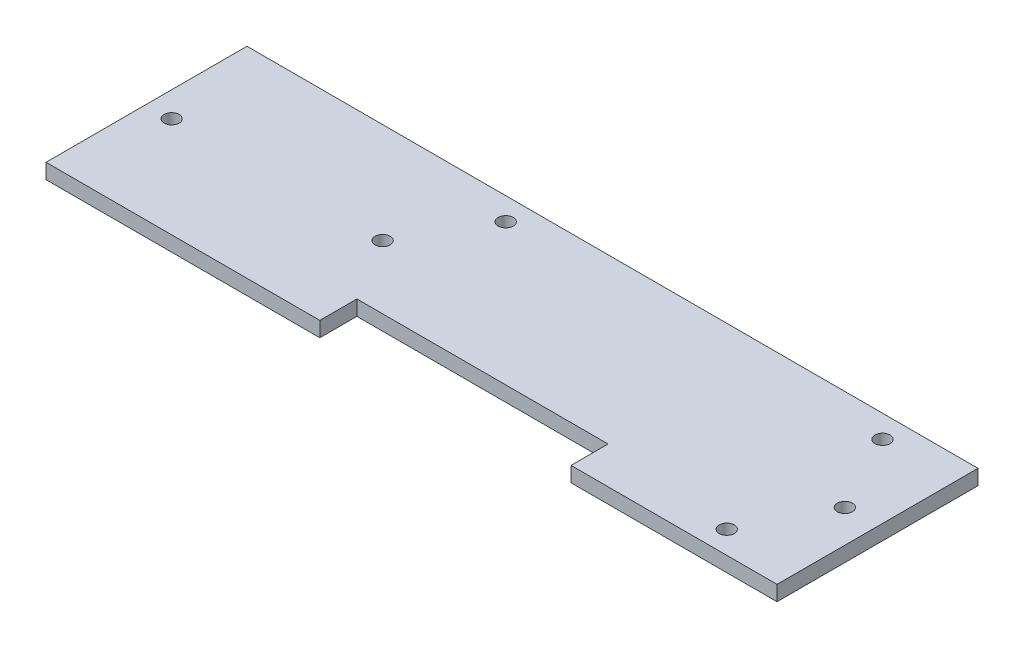
ISO-10303-21;
HEADER;
FILE_DESCRIPTION(('STEP AP214'),'2;1');
FILE_NAME('part.step','',(''),(''),'','','');
FILE_SCHEMA(('AUTOMOTIVE_DESIGN { 1 0 10303 214 1 1 1 1 }'));
ENDSEC;
DATA;
#1=APPLICATION_CONTEXT('core data for automotive mechanical design processes');
#2=APPLICATION_PROTOCOL_DEFINITION('international standard','automotive_design',2000,#1);
#3=PRODUCT_CONTEXT('',#1,'mechanical');
#4=PRODUCT('Part','Part','',(#3));
#5=PRODUCT_RELATED_PRODUCT_CATEGORY('part','',(#4));
#6=PRODUCT_DEFINITION_FORMATION('','',#4);
#7=PRODUCT_DEFINITION_CONTEXT('part definition',#1,'design');
#8=PRODUCT_DEFINITION('design','',#6,#7);
#9=PRODUCT_DEFINITION_SHAPE('','',#8);
#10=(LENGTH_UNIT() NAMED_UNIT(*) SI_UNIT(.MILLI.,.METRE.));
#11=(NAMED_UNIT(*) PLANE_ANGLE_UNIT() SI_UNIT($,.RADIAN.));
#12=(NAMED_UNIT(*) SI_UNIT($,.STERADIAN.) SOLID_ANGLE_UNIT());
#13=UNCERTAINTY_MEASURE_WITH_UNIT(LENGTH_MEASURE(1.E-05),#10,'distance_accuracy_value','');
#14=(GEOMETRIC_REPRESENTATION_CONTEXT(3) GLOBAL_UNCERTAINTY_ASSIGNED_CONTEXT((#13)) GLOBAL_UNIT_ASSIGNED_CONTEXT((#10,
#11,#12)) REPRESENTATION_CONTEXT('',''));
#15=CARTESIAN_POINT('',(0.,0.,0.));
#16=DIRECTION('',(0.,0.,1.));
#17=DIRECTION('',(1.,0.,0.));
#18=AXIS2_PLACEMENT_3D('',#15,#16,#17);
#19=CARTESIAN_POINT('',(104.5,3.,0.));
#20=DIRECTION('',(-1.,0.,0.));
#21=DIRECTION('',(0.,0.,1.));
#22=AXIS2_PLACEMENT_3D('',#19,#20,#21);
#23=PLANE('',#22);
#24=DIRECTION('',(0.,0.,-1.));
#25=VECTOR('',#24,1.);
#26=CARTESIAN_POINT('',(104.5,0.,0.));
#27=LINE('',#26,#25);
#28=CARTESIAN_POINT('',(104.5,0.,40.));
#29=VERTEX_POINT('',#28);
#30=CARTESIAN_POINT('',(104.5,0.,32.6201975596373));
#31=VERTEX_POINT('',#30);
#32=EDGE_CURVE('E166',#29,#31,#27,.T.);
#33=ORIENTED_EDGE('',*,*,#32,.F.);
#34=DIRECTION('',(0.,-1.,0.));
#35=VECTOR('',#34,1.);
#36=CARTESIAN_POINT('',(104.5,3.,40.));
#37=LINE('',#36,#35);
#38=CARTESIAN_POINT('',(104.5,3.,40.));
#39=VERTEX_POINT('',#38);
#40=EDGE_CURVE('E11',#39,#29,#37,.T.);
#41=ORIENTED_EDGE('',*,*,#40,.F.);
#42=DIRECTION('',(0.,0.,-1.));
#43=VECTOR('',#42,1.);
#44=CARTESIAN_POINT('',(104.5,3.,0.));
#45=LINE('',#44,#43);
#46=CARTESIAN_POINT('',(104.5,3.,32.6201975596373));
#47=VERTEX_POINT('',#46);
#48=EDGE_CURVE('E297',#39,#47,#45,.T.);
#49=ORIENTED_EDGE('',*,*,#48,.T.);
#50=DIRECTION('',(0.,-1.,0.));
#51=VECTOR('',#50,1.);
#52=CARTESIAN_POINT('',(104.5,3.,32.6201975596373));
#53=LINE('',#52,#51);
#54=EDGE_CURVE('E91',#47,#31,#53,.T.);
#55=ORIENTED_EDGE('',*,*,#54,.T.);
#56=EDGE_LOOP('',(#33,#41,#49,#55));
#57=FACE_BOUND('',#56,.T.);
#58=ADVANCED_FACE('F39',(#57),#23,.T.);
#59=CARTESIAN_POINT('',(0.,3.,40.));
#60=DIRECTION('',(0.,0.,-1.));
#61=DIRECTION('',(-1.,0.,0.));
#62=AXIS2_PLACEMENT_3D('',#59,#60,#61);
#63=PLANE('',#62);
#64=DIRECTION('',(1.,0.,0.));
#65=VECTOR('',#64,1.);
#66=CARTESIAN_POINT('',(0.,0.,40.));
#67=LINE('',#66,#65);
#68=CARTESIAN_POINT('',(145.508062676638,0.,40.));
#69=VERTEX_POINT('',#68);
#70=EDGE_CURVE('E163',#29,#69,#67,.T.);
#71=ORIENTED_EDGE('',*,*,#70,.T.);
#72=DIRECTION('',(0.,-1.,0.));
#73=VECTOR('',#72,1.);
#74=CARTESIAN_POINT('',(145.508062676638,3.,40.));
#75=LINE('',#74,#73);
#76=CARTESIAN_POINT('',(145.508062676638,3.,40.));
#77=VERTEX_POINT('',#76);
#78=EDGE_CURVE('E49',#77,#69,#75,.T.);
#79=ORIENTED_EDGE('',*,*,#78,.F.);
#80=DIRECTION('',(1.,0.,0.));
#81=VECTOR('',#80,1.);
#82=CARTESIAN_POINT('',(0.,3.,40.));
#83=LINE('',#82,#81);
#84=EDGE_CURVE('E132',#39,#77,#83,.T.);
#85=ORIENTED_EDGE('',*,*,#84,.F.);
#86=ORIENTED_EDGE('',*,*,#40,.T.);
#87=EDGE_LOOP('',(#71,#79,#85,#86));
#88=FACE_BOUND('',#87,.T.);
#89=ADVANCED_FACE('F164',(#88),#63,.F.);
#90=CARTESIAN_POINT('',(145.508062676638,3.,-1.00966500907628E-13));
#91=DIRECTION('',(1.,0.,0.));
#92=DIRECTION('',(0.,0.,-1.));
#93=AXIS2_PLACEMENT_3D('',#90,#91,#92);
#94=PLANE('',#93);
#95=DIRECTION('',(0.,0.,1.));
#96=VECTOR('',#95,1.);
#97=CARTESIAN_POINT('',(145.508062676638,0.,-1.00966500907628E-13));
#98=LINE('',#97,#96);
#99=CARTESIAN_POINT('',(145.508062676638,0.,0.));
#100=VERTEX_POINT('',#99);
#101=EDGE_CURVE('E157',#100,#69,#98,.T.);
#102=ORIENTED_EDGE('',*,*,#101,.F.);
#103=DIRECTION('',(0.,-1.,0.));
#104=VECTOR('',#103,1.);
#105=CARTESIAN_POINT('',(145.508062676638,3.,0.));
#106=LINE('',#105,#104);
#107=CARTESIAN_POINT('',(145.508062676638,3.,0.));
#108=VERTEX_POINT('',#107);
#109=EDGE_CURVE('E147',#108,#100,#106,.T.);
#110=ORIENTED_EDGE('',*,*,#109,.F.);
#111=DIRECTION('',(0.,0.,1.));
#112=VECTOR('',#111,1.);
#113=CARTESIAN_POINT('',(145.508062676638,3.,-1.00966500907628E-13));
#114=LINE('',#113,#112);
#115=EDGE_CURVE('E160',#108,#77,#114,.T.);
#116=ORIENTED_EDGE('',*,*,#115,.T.);
#117=ORIENTED_EDGE('',*,*,#78,.T.);
#118=EDGE_LOOP('',(#102,#110,#116,#117));
#119=FACE_BOUND('',#118,.T.);
#120=ADVANCED_FACE('F155',(#119),#94,.T.);
#121=CARTESIAN_POINT('',(0.,3.,0.));
#122=DIRECTION('',(0.,0.,-1.));
#123=DIRECTION('',(-1.,0.,0.));
#124=AXIS2_PLACEMENT_3D('',#121,#122,#123);
#125=PLANE('',#124);
#126=DIRECTION('',(1.,0.,0.));
#127=VECTOR('',#126,1.);
#128=CARTESIAN_POINT('',(0.,0.,0.));
#129=LINE('',#128,#127);
#130=CARTESIAN_POINT('',(0.,0.,0.));
#131=VERTEX_POINT('',#130);
#132=EDGE_CURVE('E171',#131,#100,#129,.T.);
#133=ORIENTED_EDGE('',*,*,#132,.F.);
#134=DIRECTION('',(0.,-1.,0.));
#135=VECTOR('',#134,1.);
#136=CARTESIAN_POINT('',(0.,3.,0.));
#137=LINE('',#136,#135);
#138=CARTESIAN_POINT('',(0.,3.,0.));
#139=VERTEX_POINT('',#138);
#140=EDGE_CURVE('E140',#139,#131,#137,.T.);
#141=ORIENTED_EDGE('',*,*,#140,.F.);
#142=DIRECTION('',(1.,0.,0.));
#143=VECTOR('',#142,1.);
#144=CARTESIAN_POINT('',(0.,3.,0.));
#145=LINE('',#144,#143);
#146=EDGE_CURVE('E291',#139,#108,#145,.T.);
#147=ORIENTED_EDGE('',*,*,#146,.T.);
#148=ORIENTED_EDGE('',*,*,#109,.T.);
#149=EDGE_LOOP('',(#133,#141,#147,#148));
#150=FACE_BOUND('',#149,.T.);
#151=ADVANCED_FACE('F283',(#150),#125,.T.);
#152=CARTESIAN_POINT('',(0.,3.,0.));
#153=DIRECTION('',(1.,0.,0.));
#154=DIRECTION('',(0.,0.,-1.));
#155=AXIS2_PLACEMENT_3D('',#152,#153,#154);
#156=PLANE('',#155);
#157=DIRECTION('',(0.,0.,1.));
#158=VECTOR('',#157,1.);
#159=CARTESIAN_POINT('',(0.,0.,0.));
#160=LINE('',#159,#158);
#161=CARTESIAN_POINT('',(0.,0.,40.));
#162=VERTEX_POINT('',#161);
#163=EDGE_CURVE('E175',#131,#162,#160,.T.);
#164=ORIENTED_EDGE('',*,*,#163,.T.);
#165=DIRECTION('',(0.,-1.,0.));
#166=VECTOR('',#165,1.);
#167=CARTESIAN_POINT('',(0.,3.,40.));
#168=LINE('',#167,#166);
#169=CARTESIAN_POINT('',(0.,3.,40.));
#170=VERTEX_POINT('',#169);
#171=EDGE_CURVE('E136',#170,#162,#168,.T.);
#172=ORIENTED_EDGE('',*,*,#171,.F.);
#173=DIRECTION('',(0.,0.,1.));
#174=VECTOR('',#173,1.);
#175=CARTESIAN_POINT('',(0.,3.,0.));
#176=LINE('',#175,#174);
#177=EDGE_CURVE('E126',#139,#170,#176,.T.);
#178=ORIENTED_EDGE('',*,*,#177,.F.);
#179=ORIENTED_EDGE('',*,*,#140,.T.);
#180=EDGE_LOOP('',(#164,#172,#178,#179));
#181=FACE_BOUND('',#180,.T.);
#182=ADVANCED_FACE('F281',(#181),#156,.F.);
#183=CARTESIAN_POINT('',(54.5,0.,40.));
#184=VERTEX_POINT('',#183);
#185=EDGE_CURVE('E134',#162,#184,#67,.T.);
#186=ORIENTED_EDGE('',*,*,#185,.T.);
#187=DIRECTION('',(0.,-1.,0.));
#188=VECTOR('',#187,1.);
#189=CARTESIAN_POINT('',(54.5,3.,40.));
#190=LINE('',#189,#188);
#191=CARTESIAN_POINT('',(54.5,3.,40.));
#192=VERTEX_POINT('',#191);
#193=EDGE_CURVE('E116',#192,#184,#190,.T.);
#194=ORIENTED_EDGE('',*,*,#193,.F.);
#195=EDGE_CURVE('E120',#170,#192,#83,.T.);
#196=ORIENTED_EDGE('',*,*,#195,.F.);
#197=ORIENTED_EDGE('',*,*,#171,.T.);
#198=EDGE_LOOP('',(#186,#194,#196,#197));
#199=FACE_BOUND('',#198,.T.);
#200=ADVANCED_FACE('F133',(#199),#63,.F.);
#201=CARTESIAN_POINT('',(54.5,3.,0.));
#202=DIRECTION('',(-1.,0.,0.));
#203=DIRECTION('',(0.,0.,1.));
#204=AXIS2_PLACEMENT_3D('',#201,#202,#203);
#205=PLANE('',#204);
#206=DIRECTION('',(0.,0.,-1.));
#207=VECTOR('',#206,1.);
#208=CARTESIAN_POINT('',(54.5,0.,0.));
#209=LINE('',#208,#207);
#210=CARTESIAN_POINT('',(54.5,0.,32.6201975596373));
#211=VERTEX_POINT('',#210);
#212=EDGE_CURVE('E182',#184,#211,#209,.T.);
#213=ORIENTED_EDGE('',*,*,#212,.T.);
#214=DIRECTION('',(0.,-1.,0.));
#215=VECTOR('',#214,1.);
#216=CARTESIAN_POINT('',(54.5,3.,32.6201975596373));
#217=LINE('',#216,#215);
#218=CARTESIAN_POINT('',(54.5,3.,32.6201975596373));
#219=VERTEX_POINT('',#218);
#220=EDGE_CURVE('E118',#219,#211,#217,.T.);
#221=ORIENTED_EDGE('',*,*,#220,.F.);
#222=DIRECTION('',(0.,0.,-1.));
#223=VECTOR('',#222,1.);
#224=CARTESIAN_POINT('',(54.5,3.,0.));
#225=LINE('',#224,#223);
#226=EDGE_CURVE('E111',#192,#219,#225,.T.);
#227=ORIENTED_EDGE('',*,*,#226,.F.);
#228=ORIENTED_EDGE('',*,*,#193,.T.);
#229=EDGE_LOOP('',(#213,#221,#227,#228));
#230=FACE_BOUND('',#229,.T.);
#231=ADVANCED_FACE('F114',(#230),#205,.F.);
#232=CARTESIAN_POINT('',(5.,3.,20.));
#233=DIRECTION('',(0.,-1.,0.));
#234=DIRECTION('',(0.,0.,-1.));
#235=AXIS2_PLACEMENT_3D('',#232,#233,#234);
#236=CYLINDRICAL_SURFACE('',#235,1.5);
#237=CARTESIAN_POINT('',(5.,3.,20.));
#238=DIRECTION('',(0.,1.,0.));
#239=DIRECTION('',(0.,0.,1.));
#240=AXIS2_PLACEMENT_3D('',#237,#238,#239);
#241=CIRCLE('',#240,1.5);
#242=CARTESIAN_POINT('',(5.,3.,21.5));
#243=VERTEX_POINT('',#242);
#244=EDGE_CURVE('E302',#243,#243,#241,.T.);
#245=ORIENTED_EDGE('',*,*,#244,.T.);
#246=EDGE_LOOP('',(#245));
#247=FACE_BOUND('',#246,.T.);
#248=CARTESIAN_POINT('',(5.,0.,20.));
#249=DIRECTION('',(0.,1.,0.));
#250=DIRECTION('',(0.,0.,1.));
#251=AXIS2_PLACEMENT_3D('',#248,#249,#250);
#252=CIRCLE('',#251,1.5);
#253=CARTESIAN_POINT('',(5.,0.,21.5));
#254=VERTEX_POINT('',#253);
#255=EDGE_CURVE('E212',#254,#254,#252,.T.);
#256=ORIENTED_EDGE('',*,*,#255,.F.);
#257=EDGE_LOOP('',(#256));
#258=FACE_BOUND('',#257,.T.);
#259=ADVANCED_FACE('F225',(#247,#258),#236,.F.);
#260=CARTESIAN_POINT('',(47.,3.,20.));
#261=DIRECTION('',(0.,-1.,0.));
#262=DIRECTION('',(0.,0.,-1.));
#263=AXIS2_PLACEMENT_3D('',#260,#261,#262);
#264=CYLINDRICAL_SURFACE('',#263,1.5);
#265=CARTESIAN_POINT('',(47.,3.,20.));
#266=DIRECTION('',(0.,1.,0.));
#267=DIRECTION('',(0.,0.,1.));
#268=AXIS2_PLACEMENT_3D('',#265,#266,#267);
#269=CIRCLE('',#268,1.5);
#270=CARTESIAN_POINT('',(47.,3.,21.5));
#271=VERTEX_POINT('',#270);
#272=EDGE_CURVE('E306',#271,#271,#269,.T.);
#273=ORIENTED_EDGE('',*,*,#272,.T.);
#274=EDGE_LOOP('',(#273));
#275=FACE_BOUND('',#274,.T.);
#276=CARTESIAN_POINT('',(47.,0.,20.));
#277=DIRECTION('',(0.,1.,0.));
#278=DIRECTION('',(0.,0.,1.));
#279=AXIS2_PLACEMENT_3D('',#276,#277,#278);
#280=CIRCLE('',#279,1.5);
#281=CARTESIAN_POINT('',(47.,0.,21.5));
#282=VERTEX_POINT('',#281);
#283=EDGE_CURVE('E208',#282,#282,#280,.T.);
#284=ORIENTED_EDGE('',*,*,#283,.F.);
#285=EDGE_LOOP('',(#284));
#286=FACE_BOUND('',#285,.T.);
#287=ADVANCED_FACE('F228',(#275,#286),#264,.F.);
#288=CARTESIAN_POINT('',(131.,3.,35.5));
#289=DIRECTION('',(0.,-1.,0.));
#290=DIRECTION('',(0.,0.,-1.));
#291=AXIS2_PLACEMENT_3D('',#288,#289,#290);
#292=CYLINDRICAL_SURFACE('',#291,1.5);
#293=CARTESIAN_POINT('',(131.,3.,35.5));
#294=DIRECTION('',(0.,1.,0.));
#295=DIRECTION('',(0.,0.,1.));
#296=AXIS2_PLACEMENT_3D('',#293,#294,#295);
#297=CIRCLE('',#296,1.5);
#298=CARTESIAN_POINT('',(131.,3.,37.));
#299=VERTEX_POINT('',#298);
#300=EDGE_CURVE('E310',#299,#299,#297,.T.);
#301=ORIENTED_EDGE('',*,*,#300,.T.);
#302=EDGE_LOOP('',(#301));
#303=FACE_BOUND('',#302,.T.);
#304=CARTESIAN_POINT('',(131.,0.,35.5));
#305=DIRECTION('',(0.,1.,0.));
#306=DIRECTION('',(0.,0.,1.));
#307=AXIS2_PLACEMENT_3D('',#304,#305,#306);
#308=CIRCLE('',#307,1.5);
#309=CARTESIAN_POINT('',(131.,0.,37.));
#310=VERTEX_POINT('',#309);
#311=EDGE_CURVE('E204',#310,#310,#308,.T.);
#312=ORIENTED_EDGE('',*,*,#311,.F.);
#313=EDGE_LOOP('',(#312));
#314=FACE_BOUND('',#313,.T.);
#315=ADVANCED_FACE('F232',(#303,#314),#292,.F.);
#316=CARTESIAN_POINT('',(131.,3.,4.50000000000002));
#317=DIRECTION('',(0.,-1.,0.));
#318=DIRECTION('',(0.,0.,-1.));
#319=AXIS2_PLACEMENT_3D('',#316,#317,#318);
#320=CYLINDRICAL_SURFACE('',#319,1.5);
#321=CARTESIAN_POINT('',(131.,3.,4.50000000000002));
#322=DIRECTION('',(0.,1.,0.));
#323=DIRECTION('',(0.,0.,1.));
#324=AXIS2_PLACEMENT_3D('',#321,#322,#323);
#325=CIRCLE('',#324,1.5);
#326=CARTESIAN_POINT('',(131.,3.,6.00000000000002));
#327=VERTEX_POINT('',#326);
#328=EDGE_CURVE('E314',#327,#327,#325,.T.);
#329=ORIENTED_EDGE('',*,*,#328,.T.);
#330=EDGE_LOOP('',(#329));
#331=FACE_BOUND('',#330,.T.);
#332=CARTESIAN_POINT('',(131.,0.,4.50000000000002));
#333=DIRECTION('',(0.,1.,0.));
#334=DIRECTION('',(0.,0.,1.));
#335=AXIS2_PLACEMENT_3D('',#332,#333,#334);
#336=CIRCLE('',#335,1.5);
#337=CARTESIAN_POINT('',(131.,0.,6.00000000000002));
#338=VERTEX_POINT('',#337);
#339=EDGE_CURVE('E200',#338,#338,#336,.T.);
#340=ORIENTED_EDGE('',*,*,#339,.F.);
#341=EDGE_LOOP('',(#340));
#342=FACE_BOUND('',#341,.T.);
#343=ADVANCED_FACE('F236',(#331,#342),#320,.F.);
#344=CARTESIAN_POINT('',(56.,3.,4.50000000000002));
#345=DIRECTION('',(0.,-1.,0.));
#346=DIRECTION('',(0.,0.,-1.));
#347=AXIS2_PLACEMENT_3D('',#344,#345,#346);
#348=CYLINDRICAL_SURFACE('',#347,1.5);
#349=CARTESIAN_POINT('',(56.,3.,4.50000000000002));
#350=DIRECTION('',(0.,1.,0.));
#351=DIRECTION('',(0.,0.,1.));
#352=AXIS2_PLACEMENT_3D('',#349,#350,#351);
#353=CIRCLE('',#352,1.5);
#354=CARTESIAN_POINT('',(56.,3.,6.00000000000002));
#355=VERTEX_POINT('',#354);
#356=EDGE_CURVE('E251',#355,#355,#353,.T.);
#357=ORIENTED_EDGE('',*,*,#356,.T.);
#358=EDGE_LOOP('',(#357));
#359=FACE_BOUND('',#358,.T.);
#360=CARTESIAN_POINT('',(56.,0.,4.50000000000002));
#361=DIRECTION('',(0.,1.,0.));
#362=DIRECTION('',(0.,0.,1.));
#363=AXIS2_PLACEMENT_3D('',#360,#361,#362);
#364=CIRCLE('',#363,1.5);
#365=CARTESIAN_POINT('',(56.,0.,6.00000000000002));
#366=VERTEX_POINT('',#365);
#367=EDGE_CURVE('E196',#366,#366,#364,.T.);
#368=ORIENTED_EDGE('',*,*,#367,.F.);
#369=EDGE_LOOP('',(#368));
#370=FACE_BOUND('',#369,.T.);
#371=ADVANCED_FACE('F239',(#359,#370),#348,.F.);
#372=CARTESIAN_POINT('',(139.,3.,20.));
#373=DIRECTION('',(0.,-1.,0.));
#374=DIRECTION('',(0.,0.,-1.));
#375=AXIS2_PLACEMENT_3D('',#372,#373,#374);
#376=CYLINDRICAL_SURFACE('',#375,1.5);
#377=CARTESIAN_POINT('',(139.,3.,20.));
#378=DIRECTION('',(0.,1.,0.));
#379=DIRECTION('',(0.,0.,1.));
#380=AXIS2_PLACEMENT_3D('',#377,#378,#379);
#381=CIRCLE('',#380,1.5);
#382=CARTESIAN_POINT('',(139.,3.,21.5));
#383=VERTEX_POINT('',#382);
#384=EDGE_CURVE('E186',#383,#383,#381,.T.);
#385=ORIENTED_EDGE('',*,*,#384,.T.);
#386=EDGE_LOOP('',(#385));
#387=FACE_BOUND('',#386,.T.);
#388=CARTESIAN_POINT('',(139.,0.,20.));
#389=DIRECTION('',(0.,1.,0.));
#390=DIRECTION('',(0.,0.,1.));
#391=AXIS2_PLACEMENT_3D('',#388,#389,#390);
#392=CIRCLE('',#391,1.5);
#393=CARTESIAN_POINT('',(139.,0.,21.5));
#394=VERTEX_POINT('',#393);
#395=EDGE_CURVE('E192',#394,#394,#392,.T.);
#396=ORIENTED_EDGE('',*,*,#395,.F.);
#397=EDGE_LOOP('',(#396));
#398=FACE_BOUND('',#397,.T.);
#399=ADVANCED_FACE('F41',(#387,#398),#376,.F.);
#400=CARTESIAN_POINT('',(0.,3.,32.6201975596373));
#401=DIRECTION('',(0.,0.,-1.));
#402=DIRECTION('',(-1.,0.,0.));
#403=AXIS2_PLACEMENT_3D('',#400,#401,#402);
#404=PLANE('',#403);
#405=DIRECTION('',(1.,0.,0.));
#406=VECTOR('',#405,1.);
#407=CARTESIAN_POINT('',(0.,0.,32.6201975596373));
#408=LINE('',#407,#406);
#409=EDGE_CURVE('E84',#211,#31,#408,.T.);
#410=ORIENTED_EDGE('',*,*,#409,.T.);
#411=ORIENTED_EDGE('',*,*,#54,.F.);
#412=DIRECTION('',(1.,0.,0.));
#413=VECTOR('',#412,1.);
#414=CARTESIAN_POINT('',(0.,3.,32.6201975596373));
#415=LINE('',#414,#413);
#416=EDGE_CURVE('E57',#219,#47,#415,.T.);
#417=ORIENTED_EDGE('',*,*,#416,.F.);
#418=ORIENTED_EDGE('',*,*,#220,.T.);
#419=EDGE_LOOP('',(#410,#411,#417,#418));
#420=FACE_BOUND('',#419,.T.);
#421=ADVANCED_FACE('F246',(#420),#404,.F.);
#422=CARTESIAN_POINT('',(0.,3.,0.));
#423=DIRECTION('',(0.,1.,0.));
#424=DIRECTION('',(0.,0.,1.));
#425=AXIS2_PLACEMENT_3D('',#422,#423,#424);
#426=PLANE('',#425);
#427=ORIENTED_EDGE('',*,*,#384,.F.);
#428=EDGE_LOOP('',(#427));
#429=FACE_BOUND('',#428,.T.);
#430=ORIENTED_EDGE('',*,*,#356,.F.);
#431=EDGE_LOOP('',(#430));
#432=FACE_BOUND('',#431,.T.);
#433=ORIENTED_EDGE('',*,*,#328,.F.);
#434=EDGE_LOOP('',(#433));
#435=FACE_BOUND('',#434,.T.);
#436=ORIENTED_EDGE('',*,*,#300,.F.);
#437=EDGE_LOOP('',(#436));
#438=FACE_BOUND('',#437,.T.);
#439=ORIENTED_EDGE('',*,*,#272,.F.);
#440=EDGE_LOOP('',(#439));
#441=FACE_BOUND('',#440,.T.);
#442=ORIENTED_EDGE('',*,*,#244,.F.);
#443=EDGE_LOOP('',(#442));
#444=FACE_BOUND('',#443,.T.);
#445=ORIENTED_EDGE('',*,*,#48,.F.);
#446=ORIENTED_EDGE('',*,*,#84,.T.);
#447=ORIENTED_EDGE('',*,*,#115,.F.);
#448=ORIENTED_EDGE('',*,*,#146,.F.);
#449=ORIENTED_EDGE('',*,*,#177,.T.);
#450=ORIENTED_EDGE('',*,*,#195,.T.);
#451=ORIENTED_EDGE('',*,*,#226,.T.);
#452=ORIENTED_EDGE('',*,*,#416,.T.);
#453=EDGE_LOOP('',(#445,#446,#447,#448,#449,#450,#451,#452));
#454=FACE_BOUND('',#453,.T.);
#455=ADVANCED_FACE('F123',(#429,#432,#435,#438,#441,#444,#454),#426,.T.);
#456=CARTESIAN_POINT('',(0.,0.,0.));
#457=DIRECTION('',(0.,1.,0.));
#458=DIRECTION('',(0.,0.,1.));
#459=AXIS2_PLACEMENT_3D('',#456,#457,#458);
#460=PLANE('',#459);
#461=ORIENTED_EDGE('',*,*,#395,.T.);
#462=EDGE_LOOP('',(#461));
#463=FACE_BOUND('',#462,.T.);
#464=ORIENTED_EDGE('',*,*,#367,.T.);
#465=EDGE_LOOP('',(#464));
#466=FACE_BOUND('',#465,.T.);
#467=ORIENTED_EDGE('',*,*,#339,.T.);
#468=EDGE_LOOP('',(#467));
#469=FACE_BOUND('',#468,.T.);
#470=ORIENTED_EDGE('',*,*,#311,.T.);
#471=EDGE_LOOP('',(#470));
#472=FACE_BOUND('',#471,.T.);
#473=ORIENTED_EDGE('',*,*,#283,.T.);
#474=EDGE_LOOP('',(#473));
#475=FACE_BOUND('',#474,.T.);
#476=ORIENTED_EDGE('',*,*,#255,.T.);
#477=EDGE_LOOP('',(#476));
#478=FACE_BOUND('',#477,.T.);
#479=ORIENTED_EDGE('',*,*,#32,.T.);
#480=ORIENTED_EDGE('',*,*,#409,.F.);
#481=ORIENTED_EDGE('',*,*,#212,.F.);
#482=ORIENTED_EDGE('',*,*,#185,.F.);
#483=ORIENTED_EDGE('',*,*,#163,.F.);
#484=ORIENTED_EDGE('',*,*,#132,.T.);
#485=ORIENTED_EDGE('',*,*,#101,.T.);
#486=ORIENTED_EDGE('',*,*,#70,.F.);
#487=EDGE_LOOP('',(#479,#480,#481,#482,#483,#484,#485,#486));
#488=FACE_BOUND('',#487,.T.);
#489=ADVANCED_FACE('F168',(#463,#466,#469,#472,#475,#478,#488),#460,.F.);
#490=CLOSED_SHELL('',(#58,#89,#120,#151,#182,#200,#231,#259,#287,#315,#343,#371,#399,#421,#455,#489));
#491=MANIFOLD_SOLID_BREP('B2',#490);
#492=ADVANCED_BREP_SHAPE_REPRESENTATION('',(#18,#491),#14);
#493=SHAPE_DEFINITION_REPRESENTATION(#9,#492);
ENDSEC;
END-ISO-10303-21;
